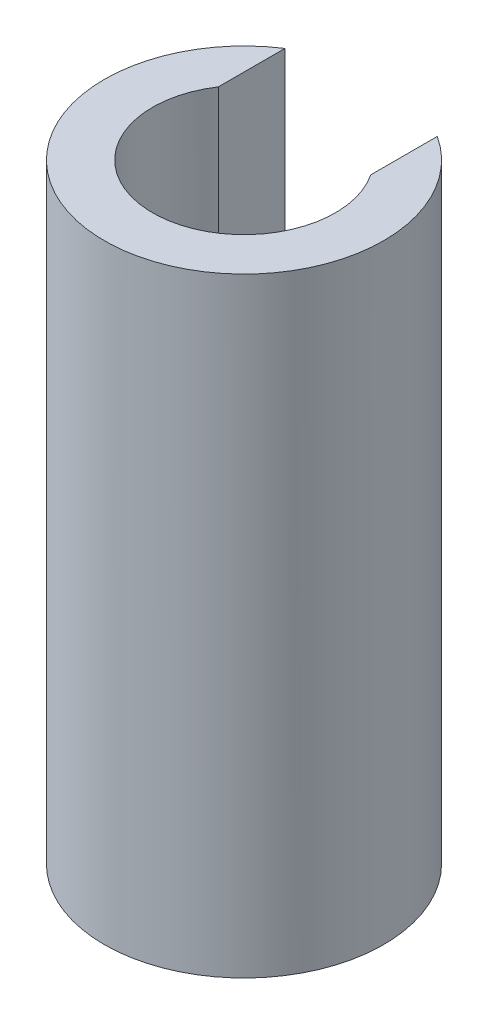
ISO-10303-21;
HEADER;
FILE_DESCRIPTION(('STEP AP214'),'2;1');
FILE_NAME('part.step','',(''),(''),'','','');
FILE_SCHEMA(('AUTOMOTIVE_DESIGN { 1 0 10303 214 1 1 1 1 }'));
ENDSEC;
DATA;
#1=APPLICATION_CONTEXT('core data for automotive mechanical design processes');
#2=APPLICATION_PROTOCOL_DEFINITION('international standard','automotive_design',2000,#1);
#3=PRODUCT_CONTEXT('',#1,'mechanical');
#4=PRODUCT('Part','Part','',(#3));
#5=PRODUCT_RELATED_PRODUCT_CATEGORY('part','',(#4));
#6=PRODUCT_DEFINITION_FORMATION('','',#4);
#7=PRODUCT_DEFINITION_CONTEXT('part definition',#1,'design');
#8=PRODUCT_DEFINITION('design','',#6,#7);
#9=PRODUCT_DEFINITION_SHAPE('','',#8);
#10=(LENGTH_UNIT() NAMED_UNIT(*) SI_UNIT(.MILLI.,.METRE.));
#11=(NAMED_UNIT(*) PLANE_ANGLE_UNIT() SI_UNIT($,.RADIAN.));
#12=(NAMED_UNIT(*) SI_UNIT($,.STERADIAN.) SOLID_ANGLE_UNIT());
#13=UNCERTAINTY_MEASURE_WITH_UNIT(LENGTH_MEASURE(1.E-05),#10,'distance_accuracy_value','');
#14=(GEOMETRIC_REPRESENTATION_CONTEXT(3) GLOBAL_UNCERTAINTY_ASSIGNED_CONTEXT((#13)) GLOBAL_UNIT_ASSIGNED_CONTEXT((#10,
#11,#12)) REPRESENTATION_CONTEXT('',''));
#15=CARTESIAN_POINT('',(0.,0.,0.));
#16=DIRECTION('',(0.,0.,1.));
#17=DIRECTION('',(1.,0.,0.));
#18=AXIS2_PLACEMENT_3D('',#15,#16,#17);
#19=CARTESIAN_POINT('',(0.,12.,0.));
#20=DIRECTION('',(0.,-1.,0.));
#21=DIRECTION('',(0.,0.,-1.));
#22=AXIS2_PLACEMENT_3D('',#19,#20,#21);
#23=CYLINDRICAL_SURFACE('',#22,2.75);
#24=CARTESIAN_POINT('',(0.,6.,0.));
#25=DIRECTION('',(0.,1.,0.));
#26=DIRECTION('',(0.,0.,1.));
#27=AXIS2_PLACEMENT_3D('',#24,#25,#26);
#28=CIRCLE('',#27,2.75);
#29=CARTESIAN_POINT('',(1.5,6.,-2.30488611432322));
#30=VERTEX_POINT('',#29);
#31=CARTESIAN_POINT('',(-1.5,6.,-2.30488611432322));
#32=VERTEX_POINT('',#31);
#33=EDGE_CURVE('E59',#30,#32,#28,.T.);
#34=ORIENTED_EDGE('',*,*,#33,.F.);
#35=DIRECTION('',(0.,-1.,0.));
#36=VECTOR('',#35,1.);
#37=CARTESIAN_POINT('',(1.5,12.,-2.30488611432322));
#38=LINE('',#37,#36);
#39=CARTESIAN_POINT('',(1.5,12.,-2.30488611432322));
#40=VERTEX_POINT('',#39);
#41=EDGE_CURVE('E109',#30,#40,#38,.F.);
#42=ORIENTED_EDGE('',*,*,#41,.T.);
#43=CARTESIAN_POINT('',(0.,12.,0.));
#44=DIRECTION('',(0.,1.,0.));
#45=DIRECTION('',(0.,0.,1.));
#46=AXIS2_PLACEMENT_3D('',#43,#44,#45);
#47=CIRCLE('',#46,2.75);
#48=CARTESIAN_POINT('',(-1.5,12.,-2.30488611432322));
#49=VERTEX_POINT('',#48);
#50=EDGE_CURVE('E93',#49,#40,#47,.T.);
#51=ORIENTED_EDGE('',*,*,#50,.F.);
#52=DIRECTION('',(0.,-1.,0.));
#53=VECTOR('',#52,1.);
#54=CARTESIAN_POINT('',(-1.5,12.,-2.30488611432322));
#55=LINE('',#54,#53);
#56=EDGE_CURVE('E125',#49,#32,#55,.T.);
#57=ORIENTED_EDGE('',*,*,#56,.T.);
#58=EDGE_LOOP('',(#34,#42,#51,#57));
#59=FACE_BOUND('',#58,.T.);
#60=CARTESIAN_POINT('',(0.,0.,0.));
#61=DIRECTION('',(0.,1.,0.));
#62=DIRECTION('',(0.,0.,1.));
#63=AXIS2_PLACEMENT_3D('',#60,#61,#62);
#64=CIRCLE('',#63,2.75);
#65=CARTESIAN_POINT('',(0.,0.,2.75));
#66=VERTEX_POINT('',#65);
#67=EDGE_CURVE('E101',#66,#66,#64,.T.);
#68=ORIENTED_EDGE('',*,*,#67,.T.);
#69=EDGE_LOOP('',(#68));
#70=FACE_BOUND('',#69,.T.);
#71=ADVANCED_FACE('F39',(#59,#70),#23,.T.);
#72=CARTESIAN_POINT('',(0.,12.,0.));
#73=DIRECTION('',(0.,1.,0.));
#74=DIRECTION('',(0.,0.,1.));
#75=AXIS2_PLACEMENT_3D('',#72,#73,#74);
#76=PLANE('',#75);
#77=DIRECTION('',(0.,0.,-1.));
#78=VECTOR('',#77,1.);
#79=CARTESIAN_POINT('',(1.5,12.,0.));
#80=LINE('',#79,#78);
#81=CARTESIAN_POINT('',(1.5,12.,-0.99498743710662));
#82=VERTEX_POINT('',#81);
#83=EDGE_CURVE('E80',#82,#40,#80,.T.);
#84=ORIENTED_EDGE('',*,*,#83,.F.);
#85=CARTESIAN_POINT('',(0.,12.,0.));
#86=DIRECTION('',(0.,-1.,0.));
#87=DIRECTION('',(0.,0.,-1.));
#88=AXIS2_PLACEMENT_3D('',#85,#86,#87);
#89=CIRCLE('',#88,1.8);
#90=CARTESIAN_POINT('',(-1.5,12.,-0.994987437106619));
#91=VERTEX_POINT('',#90);
#92=EDGE_CURVE('E91',#82,#91,#89,.T.);
#93=ORIENTED_EDGE('',*,*,#92,.T.);
#94=DIRECTION('',(0.,0.,1.));
#95=VECTOR('',#94,1.);
#96=CARTESIAN_POINT('',(-1.5,12.,0.));
#97=LINE('',#96,#95);
#98=EDGE_CURVE('E95',#49,#91,#97,.T.);
#99=ORIENTED_EDGE('',*,*,#98,.F.);
#100=ORIENTED_EDGE('',*,*,#50,.T.);
#101=EDGE_LOOP('',(#84,#93,#99,#100));
#102=FACE_BOUND('',#101,.T.);
#103=ADVANCED_FACE('F89',(#102),#76,.T.);
#104=CARTESIAN_POINT('',(0.,0.,0.));
#105=DIRECTION('',(0.,1.,0.));
#106=DIRECTION('',(0.,0.,1.));
#107=AXIS2_PLACEMENT_3D('',#104,#105,#106);
#108=PLANE('',#107);
#109=CARTESIAN_POINT('',(0.,0.,0.));
#110=DIRECTION('',(0.,-1.,0.));
#111=DIRECTION('',(0.,0.,-1.));
#112=AXIS2_PLACEMENT_3D('',#109,#110,#111);
#113=CIRCLE('',#112,1.8);
#114=CARTESIAN_POINT('',(0.,0.,-1.8));
#115=VERTEX_POINT('',#114);
#116=EDGE_CURVE('E102',#115,#115,#113,.T.);
#117=ORIENTED_EDGE('',*,*,#116,.F.);
#118=EDGE_LOOP('',(#117));
#119=FACE_BOUND('',#118,.T.);
#120=ORIENTED_EDGE('',*,*,#67,.F.);
#121=EDGE_LOOP('',(#120));
#122=FACE_BOUND('',#121,.T.);
#123=ADVANCED_FACE('F147',(#119,#122),#108,.F.);
#124=CARTESIAN_POINT('',(0.,12.,0.));
#125=DIRECTION('',(0.,-1.,0.));
#126=DIRECTION('',(0.,0.,-1.));
#127=AXIS2_PLACEMENT_3D('',#124,#125,#126);
#128=CYLINDRICAL_SURFACE('',#127,1.8);
#129=ORIENTED_EDGE('',*,*,#92,.F.);
#130=DIRECTION('',(0.,-1.,0.));
#131=VECTOR('',#130,1.);
#132=CARTESIAN_POINT('',(1.5,12.,-0.99498743710662));
#133=LINE('',#132,#131);
#134=CARTESIAN_POINT('',(1.5,6.,-0.99498743710662));
#135=VERTEX_POINT('',#134);
#136=EDGE_CURVE('E11',#82,#135,#133,.T.);
#137=ORIENTED_EDGE('',*,*,#136,.T.);
#138=CARTESIAN_POINT('',(0.,6.,0.));
#139=DIRECTION('',(0.,1.,0.));
#140=DIRECTION('',(0.,0.,1.));
#141=AXIS2_PLACEMENT_3D('',#138,#139,#140);
#142=CIRCLE('',#141,1.8);
#143=CARTESIAN_POINT('',(-1.5,6.,-0.994987437106619));
#144=VERTEX_POINT('',#143);
#145=EDGE_CURVE('E115',#144,#135,#142,.F.);
#146=ORIENTED_EDGE('',*,*,#145,.F.);
#147=DIRECTION('',(0.,-1.,0.));
#148=VECTOR('',#147,1.);
#149=CARTESIAN_POINT('',(-1.5,12.,-0.994987437106619));
#150=LINE('',#149,#148);
#151=EDGE_CURVE('E47',#144,#91,#150,.F.);
#152=ORIENTED_EDGE('',*,*,#151,.T.);
#153=EDGE_LOOP('',(#129,#137,#146,#152));
#154=FACE_BOUND('',#153,.T.);
#155=ORIENTED_EDGE('',*,*,#116,.T.);
#156=EDGE_LOOP('',(#155));
#157=FACE_BOUND('',#156,.T.);
#158=ADVANCED_FACE('F98',(#154,#157),#128,.F.);
#159=CARTESIAN_POINT('',(1.5,6.,0.));
#160=DIRECTION('',(1.,0.,0.));
#161=DIRECTION('',(0.,0.,-1.));
#162=AXIS2_PLACEMENT_3D('',#159,#160,#161);
#163=PLANE('',#162);
#164=DIRECTION('',(0.,0.,-1.));
#165=VECTOR('',#164,1.);
#166=CARTESIAN_POINT('',(1.5,6.,0.));
#167=LINE('',#166,#165);
#168=EDGE_CURVE('E82',#135,#30,#167,.T.);
#169=ORIENTED_EDGE('',*,*,#168,.F.);
#170=ORIENTED_EDGE('',*,*,#136,.F.);
#171=ORIENTED_EDGE('',*,*,#83,.T.);
#172=ORIENTED_EDGE('',*,*,#41,.F.);
#173=EDGE_LOOP('',(#169,#170,#171,#172));
#174=FACE_BOUND('',#173,.T.);
#175=ADVANCED_FACE('F79',(#174),#163,.F.);
#176=CARTESIAN_POINT('',(-1.5,6.,0.));
#177=DIRECTION('',(-1.,0.,0.));
#178=DIRECTION('',(0.,0.,1.));
#179=AXIS2_PLACEMENT_3D('',#176,#177,#178);
#180=PLANE('',#179);
#181=ORIENTED_EDGE('',*,*,#98,.T.);
#182=ORIENTED_EDGE('',*,*,#151,.F.);
#183=DIRECTION('',(0.,0.,1.));
#184=VECTOR('',#183,1.);
#185=CARTESIAN_POINT('',(-1.5,6.,0.));
#186=LINE('',#185,#184);
#187=EDGE_CURVE('E54',#32,#144,#186,.T.);
#188=ORIENTED_EDGE('',*,*,#187,.F.);
#189=ORIENTED_EDGE('',*,*,#56,.F.);
#190=EDGE_LOOP('',(#181,#182,#188,#189));
#191=FACE_BOUND('',#190,.T.);
#192=ADVANCED_FACE('F134',(#191),#180,.F.);
#193=CARTESIAN_POINT('',(0.,6.,0.));
#194=DIRECTION('',(0.,1.,0.));
#195=DIRECTION('',(0.,0.,1.));
#196=AXIS2_PLACEMENT_3D('',#193,#194,#195);
#197=PLANE('',#196);
#198=ORIENTED_EDGE('',*,*,#33,.T.);
#199=ORIENTED_EDGE('',*,*,#187,.T.);
#200=ORIENTED_EDGE('',*,*,#145,.T.);
#201=ORIENTED_EDGE('',*,*,#168,.T.);
#202=EDGE_LOOP('',(#198,#199,#200,#201));
#203=FACE_BOUND('',#202,.T.);
#204=ADVANCED_FACE('F119',(#203),#197,.T.);
#205=CLOSED_SHELL('',(#71,#103,#123,#158,#175,#192,#204));
#206=MANIFOLD_SOLID_BREP('B2',#205);
#207=ADVANCED_BREP_SHAPE_REPRESENTATION('',(#18,#206),#14);
#208=SHAPE_DEFINITION_REPRESENTATION(#9,#207);
ENDSEC;
END-ISO-10303-21;
